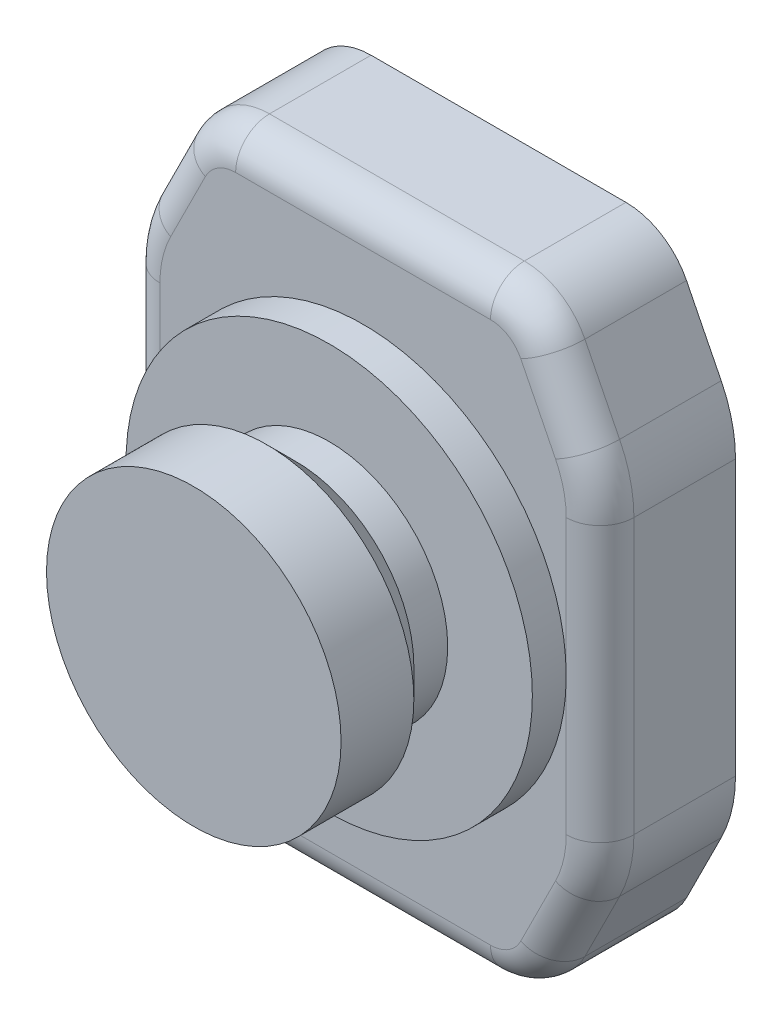
ISO-10303-21;
HEADER;
FILE_DESCRIPTION(('STEP AP214'),'2;1');
FILE_NAME('part.step','',(''),(''),'','','');
FILE_SCHEMA(('AUTOMOTIVE_DESIGN { 1 0 10303 214 1 1 1 1 }'));
ENDSEC;
DATA;
#1=APPLICATION_CONTEXT('core data for automotive mechanical design processes');
#2=APPLICATION_PROTOCOL_DEFINITION('international standard','automotive_design',2000,#1);
#3=PRODUCT_CONTEXT('',#1,'mechanical');
#4=PRODUCT('Part','Part','',(#3));
#5=PRODUCT_RELATED_PRODUCT_CATEGORY('part','',(#4));
#6=PRODUCT_DEFINITION_FORMATION('','',#4);
#7=PRODUCT_DEFINITION_CONTEXT('part definition',#1,'design');
#8=PRODUCT_DEFINITION('design','',#6,#7);
#9=PRODUCT_DEFINITION_SHAPE('','',#8);
#10=(LENGTH_UNIT() NAMED_UNIT(*) SI_UNIT(.MILLI.,.METRE.));
#11=(NAMED_UNIT(*) PLANE_ANGLE_UNIT() SI_UNIT($,.RADIAN.));
#12=(NAMED_UNIT(*) SI_UNIT($,.STERADIAN.) SOLID_ANGLE_UNIT());
#13=UNCERTAINTY_MEASURE_WITH_UNIT(LENGTH_MEASURE(1.E-05),#10,'distance_accuracy_value','');
#14=(GEOMETRIC_REPRESENTATION_CONTEXT(3) GLOBAL_UNCERTAINTY_ASSIGNED_CONTEXT((#13)) GLOBAL_UNIT_ASSIGNED_CONTEXT((#10,
#11,#12)) REPRESENTATION_CONTEXT('',''));
#15=CARTESIAN_POINT('',(0.,0.,0.));
#16=DIRECTION('',(0.,0.,1.));
#17=DIRECTION('',(1.,0.,0.));
#18=AXIS2_PLACEMENT_3D('',#15,#16,#17);
#19=CARTESIAN_POINT('',(-18.819660112501,-35.,20.));
#20=DIRECTION('',(0.,0.,1.));
#21=DIRECTION('',(1.,0.,0.));
#22=AXIS2_PLACEMENT_3D('',#19,#20,#21);
#23=PLANE('',#22);
#24=DIRECTION('',(0.,1.,0.));
#25=VECTOR('',#24,1.);
#26=CARTESIAN_POINT('',(30.,20.2786404500042,20.));
#27=LINE('',#26,#25);
#28=CARTESIAN_POINT('',(30.,-20.2786404500042,20.));
#29=VERTEX_POINT('',#28);
#30=CARTESIAN_POINT('',(30.,0.,20.));
#31=VERTEX_POINT('',#30);
#32=EDGE_CURVE('E215',#29,#31,#27,.T.);
#33=ORIENTED_EDGE('',*,*,#32,.T.);
#34=CARTESIAN_POINT('',(0.,0.,20.));
#35=DIRECTION('',(0.,0.,1.));
#36=DIRECTION('',(1.,0.,0.));
#37=AXIS2_PLACEMENT_3D('',#34,#35,#36);
#38=CIRCLE('',#37,30.);
#39=CARTESIAN_POINT('',(-30.,0.,20.));
#40=VERTEX_POINT('',#39);
#41=EDGE_CURVE('E51',#40,#31,#38,.T.);
#42=ORIENTED_EDGE('',*,*,#41,.F.);
#43=DIRECTION('',(0.,-1.,0.));
#44=VECTOR('',#43,1.);
#45=CARTESIAN_POINT('',(-30.,-20.2786404500042,20.));
#46=LINE('',#45,#44);
#47=CARTESIAN_POINT('',(-30.,-20.2786404500042,20.));
#48=VERTEX_POINT('',#47);
#49=EDGE_CURVE('E212',#40,#48,#46,.T.);
#50=ORIENTED_EDGE('',*,*,#49,.T.);
#51=CARTESIAN_POINT('',(-15.,-20.2786404500042,20.));
#52=DIRECTION('',(0.,0.,1.));
#53=DIRECTION('',(1.,0.,0.));
#54=AXIS2_PLACEMENT_3D('',#51,#52,#53);
#55=CIRCLE('',#54,15.);
#56=CARTESIAN_POINT('',(-28.4164078649987,-26.9868443825036,20.));
#57=VERTEX_POINT('',#56);
#58=EDGE_CURVE('E231',#48,#57,#55,.T.);
#59=ORIENTED_EDGE('',*,*,#58,.T.);
#60=DIRECTION('',(0.447213595499958,-0.894427190999916,0.));
#61=VECTOR('',#60,1.);
#62=CARTESIAN_POINT('',(-23.2917960675006,-37.2360679774998,20.));
#63=LINE('',#62,#61);
#64=CARTESIAN_POINT('',(-23.2917960675006,-37.2360679774998,20.));
#65=VERTEX_POINT('',#64);
#66=EDGE_CURVE('E232',#57,#65,#63,.T.);
#67=ORIENTED_EDGE('',*,*,#66,.T.);
#68=CARTESIAN_POINT('',(-18.819660112501,-35.,20.));
#69=DIRECTION('',(0.,0.,1.));
#70=DIRECTION('',(1.,0.,0.));
#71=AXIS2_PLACEMENT_3D('',#68,#69,#70);
#72=CIRCLE('',#71,5.);
#73=CARTESIAN_POINT('',(-18.819660112501,-40.,20.));
#74=VERTEX_POINT('',#73);
#75=EDGE_CURVE('E405',#65,#74,#72,.T.);
#76=ORIENTED_EDGE('',*,*,#75,.T.);
#77=DIRECTION('',(1.,0.,0.));
#78=VECTOR('',#77,1.);
#79=CARTESIAN_POINT('',(18.8196601125011,-40.,20.));
#80=LINE('',#79,#78);
#81=CARTESIAN_POINT('',(18.8196601125011,-40.,20.));
#82=VERTEX_POINT('',#81);
#83=EDGE_CURVE('E407',#74,#82,#80,.T.);
#84=ORIENTED_EDGE('',*,*,#83,.T.);
#85=CARTESIAN_POINT('',(18.819660112501,-35.,20.));
#86=DIRECTION('',(0.,0.,1.));
#87=DIRECTION('',(1.,0.,0.));
#88=AXIS2_PLACEMENT_3D('',#85,#86,#87);
#89=CIRCLE('',#88,5.);
#90=CARTESIAN_POINT('',(23.2917960675006,-37.2360679774998,20.));
#91=VERTEX_POINT('',#90);
#92=EDGE_CURVE('E409',#82,#91,#89,.T.);
#93=ORIENTED_EDGE('',*,*,#92,.T.);
#94=DIRECTION('',(0.447213595499958,0.894427190999916,0.));
#95=VECTOR('',#94,1.);
#96=CARTESIAN_POINT('',(28.4164078649987,-26.9868443825036,20.));
#97=LINE('',#96,#95);
#98=CARTESIAN_POINT('',(28.4164078649987,-26.9868443825036,20.));
#99=VERTEX_POINT('',#98);
#100=EDGE_CURVE('E411',#91,#99,#97,.T.);
#101=ORIENTED_EDGE('',*,*,#100,.T.);
#102=CARTESIAN_POINT('',(15.,-20.2786404500042,20.));
#103=DIRECTION('',(0.,0.,1.));
#104=DIRECTION('',(1.,0.,0.));
#105=AXIS2_PLACEMENT_3D('',#102,#103,#104);
#106=CIRCLE('',#105,15.);
#107=EDGE_CURVE('E413',#99,#29,#106,.T.);
#108=ORIENTED_EDGE('',*,*,#107,.T.);
#109=EDGE_LOOP('',(#33,#42,#50,#59,#67,#76,#84,#93,#101,#108));
#110=FACE_BOUND('',#109,.T.);
#111=ADVANCED_FACE('F36',(#110),#23,.T.);
#112=CARTESIAN_POINT('',(-18.819660112501,-35.,20.));
#113=DIRECTION('',(0.,0.,-1.));
#114=DIRECTION('',(-1.,0.,0.));
#115=AXIS2_PLACEMENT_3D('',#112,#113,#114);
#116=CYLINDRICAL_SURFACE('',#115,10.);
#117=DIRECTION('',(0.,0.,-1.));
#118=VECTOR('',#117,1.);
#119=CARTESIAN_POINT('',(-18.819660112501,-45.,20.));
#120=LINE('',#119,#118);
#121=CARTESIAN_POINT('',(-18.819660112501,-45.,15.));
#122=VERTEX_POINT('',#121);
#123=CARTESIAN_POINT('',(-18.819660112501,-45.,0.));
#124=VERTEX_POINT('',#123);
#125=EDGE_CURVE('E403',#122,#124,#120,.T.);
#126=ORIENTED_EDGE('',*,*,#125,.F.);
#127=CARTESIAN_POINT('',(-18.819660112501,-35.,15.));
#128=DIRECTION('',(0.,0.,1.));
#129=DIRECTION('',(1.,0.,0.));
#130=AXIS2_PLACEMENT_3D('',#127,#128,#129);
#131=CIRCLE('',#130,10.);
#132=CARTESIAN_POINT('',(-27.7639320225002,-39.4721359549996,15.));
#133=VERTEX_POINT('',#132);
#134=EDGE_CURVE('E269',#122,#133,#131,.F.);
#135=ORIENTED_EDGE('',*,*,#134,.T.);
#136=DIRECTION('',(0.,0.,-1.));
#137=VECTOR('',#136,1.);
#138=CARTESIAN_POINT('',(-27.7639320225002,-39.4721359549996,20.));
#139=LINE('',#138,#137);
#140=CARTESIAN_POINT('',(-27.7639320225002,-39.4721359549996,0.));
#141=VERTEX_POINT('',#140);
#142=EDGE_CURVE('E373',#133,#141,#139,.T.);
#143=ORIENTED_EDGE('',*,*,#142,.T.);
#144=CARTESIAN_POINT('',(-18.819660112501,-35.,0.));
#145=DIRECTION('',(0.,0.,1.));
#146=DIRECTION('',(1.,0.,0.));
#147=AXIS2_PLACEMENT_3D('',#144,#145,#146);
#148=CIRCLE('',#147,10.);
#149=EDGE_CURVE('E314',#141,#124,#148,.T.);
#150=ORIENTED_EDGE('',*,*,#149,.T.);
#151=EDGE_LOOP('',(#126,#135,#143,#150));
#152=FACE_BOUND('',#151,.T.);
#153=ADVANCED_FACE('F531',(#152),#116,.T.);
#154=CARTESIAN_POINT('',(-18.819660112501,-45.,20.));
#155=DIRECTION('',(0.,1.,0.));
#156=DIRECTION('',(0.,0.,1.));
#157=AXIS2_PLACEMENT_3D('',#154,#155,#156);
#158=PLANE('',#157);
#159=DIRECTION('',(0.,0.,-1.));
#160=VECTOR('',#159,1.);
#161=CARTESIAN_POINT('',(18.8196601125011,-45.,20.));
#162=LINE('',#161,#160);
#163=CARTESIAN_POINT('',(18.8196601125011,-45.,15.));
#164=VERTEX_POINT('',#163);
#165=CARTESIAN_POINT('',(18.8196601125011,-45.,0.));
#166=VERTEX_POINT('',#165);
#167=EDGE_CURVE('E401',#164,#166,#162,.T.);
#168=ORIENTED_EDGE('',*,*,#167,.F.);
#169=DIRECTION('',(1.,0.,0.));
#170=VECTOR('',#169,1.);
#171=CARTESIAN_POINT('',(-18.819660112501,-45.,15.));
#172=LINE('',#171,#170);
#173=EDGE_CURVE('E59',#164,#122,#172,.F.);
#174=ORIENTED_EDGE('',*,*,#173,.T.);
#175=ORIENTED_EDGE('',*,*,#125,.T.);
#176=DIRECTION('',(1.,0.,0.));
#177=VECTOR('',#176,1.);
#178=CARTESIAN_POINT('',(-18.819660112501,-45.,0.));
#179=LINE('',#178,#177);
#180=EDGE_CURVE('E328',#124,#166,#179,.T.);
#181=ORIENTED_EDGE('',*,*,#180,.T.);
#182=EDGE_LOOP('',(#168,#174,#175,#181));
#183=FACE_BOUND('',#182,.T.);
#184=ADVANCED_FACE('F533',(#183),#158,.F.);
#185=CARTESIAN_POINT('',(18.819660112501,-35.,20.));
#186=DIRECTION('',(0.,0.,-1.));
#187=DIRECTION('',(-1.,0.,0.));
#188=AXIS2_PLACEMENT_3D('',#185,#186,#187);
#189=CYLINDRICAL_SURFACE('',#188,10.);
#190=DIRECTION('',(0.,0.,-1.));
#191=VECTOR('',#190,1.);
#192=CARTESIAN_POINT('',(27.7639320225002,-39.4721359549996,20.));
#193=LINE('',#192,#191);
#194=CARTESIAN_POINT('',(27.7639320225002,-39.4721359549996,15.));
#195=VERTEX_POINT('',#194);
#196=CARTESIAN_POINT('',(27.7639320225002,-39.4721359549996,0.));
#197=VERTEX_POINT('',#196);
#198=EDGE_CURVE('E399',#195,#197,#193,.T.);
#199=ORIENTED_EDGE('',*,*,#198,.F.);
#200=CARTESIAN_POINT('',(18.819660112501,-35.,15.));
#201=DIRECTION('',(0.,0.,1.));
#202=DIRECTION('',(1.,0.,0.));
#203=AXIS2_PLACEMENT_3D('',#200,#201,#202);
#204=CIRCLE('',#203,10.);
#205=EDGE_CURVE('E266',#195,#164,#204,.F.);
#206=ORIENTED_EDGE('',*,*,#205,.T.);
#207=ORIENTED_EDGE('',*,*,#167,.T.);
#208=CARTESIAN_POINT('',(18.819660112501,-35.,0.));
#209=DIRECTION('',(0.,0.,1.));
#210=DIRECTION('',(-1.,0.,0.));
#211=AXIS2_PLACEMENT_3D('',#208,#209,#210);
#212=CIRCLE('',#211,10.);
#213=EDGE_CURVE('E331',#166,#197,#212,.T.);
#214=ORIENTED_EDGE('',*,*,#213,.T.);
#215=EDGE_LOOP('',(#199,#206,#207,#214));
#216=FACE_BOUND('',#215,.T.);
#217=ADVANCED_FACE('F539',(#216),#189,.T.);
#218=CARTESIAN_POINT('',(27.7639320225002,-39.4721359549996,20.));
#219=DIRECTION('',(-0.894427190999916,0.447213595499958,0.));
#220=DIRECTION('',(-0.447213595499958,-0.894427190999916,0.));
#221=AXIS2_PLACEMENT_3D('',#218,#219,#220);
#222=PLANE('',#221);
#223=DIRECTION('',(0.,0.,-1.));
#224=VECTOR('',#223,1.);
#225=CARTESIAN_POINT('',(32.8885438199983,-29.2229123600034,20.));
#226=LINE('',#225,#224);
#227=CARTESIAN_POINT('',(32.8885438199983,-29.2229123600034,15.));
#228=VERTEX_POINT('',#227);
#229=CARTESIAN_POINT('',(32.8885438199983,-29.2229123600034,0.));
#230=VERTEX_POINT('',#229);
#231=EDGE_CURVE('E397',#228,#230,#226,.T.);
#232=ORIENTED_EDGE('',*,*,#231,.F.);
#233=DIRECTION('',(0.447213595499958,0.894427190999916,0.));
#234=VECTOR('',#233,1.);
#235=CARTESIAN_POINT('',(27.7639320225002,-39.4721359549996,15.));
#236=LINE('',#235,#234);
#237=EDGE_CURVE('E264',#228,#195,#236,.F.);
#238=ORIENTED_EDGE('',*,*,#237,.T.);
#239=ORIENTED_EDGE('',*,*,#198,.T.);
#240=DIRECTION('',(0.447213595499958,0.894427190999916,0.));
#241=VECTOR('',#240,1.);
#242=CARTESIAN_POINT('',(27.7639320225002,-39.4721359549996,0.));
#243=LINE('',#242,#241);
#244=EDGE_CURVE('E334',#197,#230,#243,.T.);
#245=ORIENTED_EDGE('',*,*,#244,.T.);
#246=EDGE_LOOP('',(#232,#238,#239,#245));
#247=FACE_BOUND('',#246,.T.);
#248=ADVANCED_FACE('F542',(#247),#222,.F.);
#249=CARTESIAN_POINT('',(15.,-20.2786404500042,20.));
#250=DIRECTION('',(0.,0.,-1.));
#251=DIRECTION('',(-1.,0.,0.));
#252=AXIS2_PLACEMENT_3D('',#249,#250,#251);
#253=CYLINDRICAL_SURFACE('',#252,20.);
#254=DIRECTION('',(0.,0.,-1.));
#255=VECTOR('',#254,1.);
#256=CARTESIAN_POINT('',(35.,-20.2786404500042,20.));
#257=LINE('',#256,#255);
#258=CARTESIAN_POINT('',(35.,-20.2786404500042,15.));
#259=VERTEX_POINT('',#258);
#260=CARTESIAN_POINT('',(35.,-20.2786404500042,0.));
#261=VERTEX_POINT('',#260);
#262=EDGE_CURVE('E395',#259,#261,#257,.T.);
#263=ORIENTED_EDGE('',*,*,#262,.F.);
#264=CARTESIAN_POINT('',(15.,-20.2786404500042,15.));
#265=DIRECTION('',(0.,0.,1.));
#266=DIRECTION('',(1.,0.,0.));
#267=AXIS2_PLACEMENT_3D('',#264,#265,#266);
#268=CIRCLE('',#267,20.);
#269=EDGE_CURVE('E262',#259,#228,#268,.F.);
#270=ORIENTED_EDGE('',*,*,#269,.T.);
#271=ORIENTED_EDGE('',*,*,#231,.T.);
#272=CARTESIAN_POINT('',(15.,-20.2786404500042,0.));
#273=DIRECTION('',(0.,0.,1.));
#274=DIRECTION('',(1.,0.,0.));
#275=AXIS2_PLACEMENT_3D('',#272,#273,#274);
#276=CIRCLE('',#275,20.);
#277=EDGE_CURVE('E337',#230,#261,#276,.T.);
#278=ORIENTED_EDGE('',*,*,#277,.T.);
#279=EDGE_LOOP('',(#263,#270,#271,#278));
#280=FACE_BOUND('',#279,.T.);
#281=ADVANCED_FACE('F545',(#280),#253,.T.);
#282=CARTESIAN_POINT('',(35.,-20.2786404500042,20.));
#283=DIRECTION('',(-1.,0.,0.));
#284=DIRECTION('',(0.,0.,1.));
#285=AXIS2_PLACEMENT_3D('',#282,#283,#284);
#286=PLANE('',#285);
#287=DIRECTION('',(0.,0.,-1.));
#288=VECTOR('',#287,1.);
#289=CARTESIAN_POINT('',(35.,20.2786404500042,20.));
#290=LINE('',#289,#288);
#291=CARTESIAN_POINT('',(35.,20.2786404500042,15.));
#292=VERTEX_POINT('',#291);
#293=CARTESIAN_POINT('',(35.,20.2786404500042,0.));
#294=VERTEX_POINT('',#293);
#295=EDGE_CURVE('E393',#292,#294,#290,.T.);
#296=ORIENTED_EDGE('',*,*,#295,.F.);
#297=DIRECTION('',(0.,1.,0.));
#298=VECTOR('',#297,1.);
#299=CARTESIAN_POINT('',(35.,-20.2786404500042,15.));
#300=LINE('',#299,#298);
#301=EDGE_CURVE('E260',#292,#259,#300,.F.);
#302=ORIENTED_EDGE('',*,*,#301,.T.);
#303=ORIENTED_EDGE('',*,*,#262,.T.);
#304=DIRECTION('',(0.,1.,0.));
#305=VECTOR('',#304,1.);
#306=CARTESIAN_POINT('',(35.,-20.2786404500042,0.));
#307=LINE('',#306,#305);
#308=EDGE_CURVE('E340',#261,#294,#307,.T.);
#309=ORIENTED_EDGE('',*,*,#308,.T.);
#310=EDGE_LOOP('',(#296,#302,#303,#309));
#311=FACE_BOUND('',#310,.T.);
#312=ADVANCED_FACE('F549',(#311),#286,.F.);
#313=CARTESIAN_POINT('',(15.,20.2786404500042,20.));
#314=DIRECTION('',(0.,0.,-1.));
#315=DIRECTION('',(-1.,0.,0.));
#316=AXIS2_PLACEMENT_3D('',#313,#314,#315);
#317=CYLINDRICAL_SURFACE('',#316,20.);
#318=DIRECTION('',(0.,0.,-1.));
#319=VECTOR('',#318,1.);
#320=CARTESIAN_POINT('',(32.8885438199983,29.2229123600033,20.));
#321=LINE('',#320,#319);
#322=CARTESIAN_POINT('',(32.8885438199983,29.2229123600033,15.));
#323=VERTEX_POINT('',#322);
#324=CARTESIAN_POINT('',(32.8885438199983,29.2229123600033,0.));
#325=VERTEX_POINT('',#324);
#326=EDGE_CURVE('E391',#323,#325,#321,.T.);
#327=ORIENTED_EDGE('',*,*,#326,.F.);
#328=CARTESIAN_POINT('',(15.,20.2786404500042,15.));
#329=DIRECTION('',(0.,0.,1.));
#330=DIRECTION('',(1.,0.,0.));
#331=AXIS2_PLACEMENT_3D('',#328,#329,#330);
#332=CIRCLE('',#331,20.);
#333=EDGE_CURVE('E258',#323,#292,#332,.F.);
#334=ORIENTED_EDGE('',*,*,#333,.T.);
#335=ORIENTED_EDGE('',*,*,#295,.T.);
#336=CARTESIAN_POINT('',(15.,20.2786404500042,0.));
#337=DIRECTION('',(0.,0.,1.));
#338=DIRECTION('',(-1.,0.,0.));
#339=AXIS2_PLACEMENT_3D('',#336,#337,#338);
#340=CIRCLE('',#339,20.);
#341=EDGE_CURVE('E343',#294,#325,#340,.T.);
#342=ORIENTED_EDGE('',*,*,#341,.T.);
#343=EDGE_LOOP('',(#327,#334,#335,#342));
#344=FACE_BOUND('',#343,.T.);
#345=ADVANCED_FACE('F553',(#344),#317,.T.);
#346=CARTESIAN_POINT('',(27.7639320225002,39.4721359549996,20.));
#347=DIRECTION('',(-0.894427190999916,-0.447213595499958,0.));
#348=DIRECTION('',(0.447213595499958,-0.894427190999916,0.));
#349=AXIS2_PLACEMENT_3D('',#346,#347,#348);
#350=PLANE('',#349);
#351=DIRECTION('',(0.,0.,-1.));
#352=VECTOR('',#351,1.);
#353=CARTESIAN_POINT('',(27.7639320225002,39.4721359549996,20.));
#354=LINE('',#353,#352);
#355=CARTESIAN_POINT('',(27.7639320225002,39.4721359549996,15.));
#356=VERTEX_POINT('',#355);
#357=CARTESIAN_POINT('',(27.7639320225002,39.4721359549996,0.));
#358=VERTEX_POINT('',#357);
#359=EDGE_CURVE('E389',#356,#358,#354,.T.);
#360=ORIENTED_EDGE('',*,*,#359,.F.);
#361=DIRECTION('',(-0.447213595499958,0.894427190999916,0.));
#362=VECTOR('',#361,1.);
#363=CARTESIAN_POINT('',(32.8885438199983,29.2229123600034,15.));
#364=LINE('',#363,#362);
#365=EDGE_CURVE('E256',#356,#323,#364,.F.);
#366=ORIENTED_EDGE('',*,*,#365,.T.);
#367=ORIENTED_EDGE('',*,*,#326,.T.);
#368=DIRECTION('',(-0.447213595499958,0.894427190999916,0.));
#369=VECTOR('',#368,1.);
#370=CARTESIAN_POINT('',(27.7639320225002,39.4721359549996,0.));
#371=LINE('',#370,#369);
#372=EDGE_CURVE('E346',#325,#358,#371,.T.);
#373=ORIENTED_EDGE('',*,*,#372,.T.);
#374=EDGE_LOOP('',(#360,#366,#367,#373));
#375=FACE_BOUND('',#374,.T.);
#376=ADVANCED_FACE('F557',(#375),#350,.F.);
#377=CARTESIAN_POINT('',(18.819660112501,35.,20.));
#378=DIRECTION('',(0.,0.,-1.));
#379=DIRECTION('',(-1.,0.,0.));
#380=AXIS2_PLACEMENT_3D('',#377,#378,#379);
#381=CYLINDRICAL_SURFACE('',#380,10.);
#382=DIRECTION('',(0.,0.,-1.));
#383=VECTOR('',#382,1.);
#384=CARTESIAN_POINT('',(18.819660112501,45.,20.));
#385=LINE('',#384,#383);
#386=CARTESIAN_POINT('',(18.819660112501,45.,15.));
#387=VERTEX_POINT('',#386);
#388=CARTESIAN_POINT('',(18.819660112501,45.,0.));
#389=VERTEX_POINT('',#388);
#390=EDGE_CURVE('E387',#387,#389,#385,.T.);
#391=ORIENTED_EDGE('',*,*,#390,.F.);
#392=CARTESIAN_POINT('',(18.819660112501,35.,15.));
#393=DIRECTION('',(0.,0.,1.));
#394=DIRECTION('',(1.,0.,0.));
#395=AXIS2_PLACEMENT_3D('',#392,#393,#394);
#396=CIRCLE('',#395,10.);
#397=EDGE_CURVE('E254',#387,#356,#396,.F.);
#398=ORIENTED_EDGE('',*,*,#397,.T.);
#399=ORIENTED_EDGE('',*,*,#359,.T.);
#400=CARTESIAN_POINT('',(18.819660112501,35.,0.));
#401=DIRECTION('',(0.,0.,1.));
#402=DIRECTION('',(1.,0.,0.));
#403=AXIS2_PLACEMENT_3D('',#400,#401,#402);
#404=CIRCLE('',#403,10.);
#405=EDGE_CURVE('E349',#358,#389,#404,.T.);
#406=ORIENTED_EDGE('',*,*,#405,.T.);
#407=EDGE_LOOP('',(#391,#398,#399,#406));
#408=FACE_BOUND('',#407,.T.);
#409=ADVANCED_FACE('F559',(#408),#381,.T.);
#410=CARTESIAN_POINT('',(-18.8196601125011,45.,20.));
#411=DIRECTION('',(0.,-1.,0.));
#412=DIRECTION('',(0.,0.,-1.));
#413=AXIS2_PLACEMENT_3D('',#410,#411,#412);
#414=PLANE('',#413);
#415=DIRECTION('',(0.,0.,-1.));
#416=VECTOR('',#415,1.);
#417=CARTESIAN_POINT('',(-18.8196601125011,45.,20.));
#418=LINE('',#417,#416);
#419=CARTESIAN_POINT('',(-18.8196601125011,45.,15.));
#420=VERTEX_POINT('',#419);
#421=CARTESIAN_POINT('',(-18.8196601125011,45.,0.));
#422=VERTEX_POINT('',#421);
#423=EDGE_CURVE('E385',#420,#422,#418,.T.);
#424=ORIENTED_EDGE('',*,*,#423,.F.);
#425=DIRECTION('',(-1.,0.,0.));
#426=VECTOR('',#425,1.);
#427=CARTESIAN_POINT('',(18.819660112501,45.,15.));
#428=LINE('',#427,#426);
#429=EDGE_CURVE('E252',#420,#387,#428,.F.);
#430=ORIENTED_EDGE('',*,*,#429,.T.);
#431=ORIENTED_EDGE('',*,*,#390,.T.);
#432=DIRECTION('',(-1.,0.,0.));
#433=VECTOR('',#432,1.);
#434=CARTESIAN_POINT('',(-18.8196601125011,45.,0.));
#435=LINE('',#434,#433);
#436=EDGE_CURVE('E352',#389,#422,#435,.T.);
#437=ORIENTED_EDGE('',*,*,#436,.T.);
#438=EDGE_LOOP('',(#424,#430,#431,#437));
#439=FACE_BOUND('',#438,.T.);
#440=ADVANCED_FACE('F505',(#439),#414,.F.);
#441=CARTESIAN_POINT('',(-18.8196601125011,35.,20.));
#442=DIRECTION('',(0.,0.,-1.));
#443=DIRECTION('',(-1.,0.,0.));
#444=AXIS2_PLACEMENT_3D('',#441,#442,#443);
#445=CYLINDRICAL_SURFACE('',#444,10.);
#446=DIRECTION('',(0.,0.,-1.));
#447=VECTOR('',#446,1.);
#448=CARTESIAN_POINT('',(-27.7639320225002,39.4721359549996,20.));
#449=LINE('',#448,#447);
#450=CARTESIAN_POINT('',(-27.7639320225002,39.4721359549996,15.));
#451=VERTEX_POINT('',#450);
#452=CARTESIAN_POINT('',(-27.7639320225002,39.4721359549996,0.));
#453=VERTEX_POINT('',#452);
#454=EDGE_CURVE('E383',#451,#453,#449,.T.);
#455=ORIENTED_EDGE('',*,*,#454,.F.);
#456=CARTESIAN_POINT('',(-18.8196601125011,35.,15.));
#457=DIRECTION('',(0.,0.,1.));
#458=DIRECTION('',(1.,0.,0.));
#459=AXIS2_PLACEMENT_3D('',#456,#457,#458);
#460=CIRCLE('',#459,10.);
#461=EDGE_CURVE('E250',#451,#420,#460,.F.);
#462=ORIENTED_EDGE('',*,*,#461,.T.);
#463=ORIENTED_EDGE('',*,*,#423,.T.);
#464=CARTESIAN_POINT('',(-18.8196601125011,35.,0.));
#465=DIRECTION('',(0.,0.,1.));
#466=DIRECTION('',(-1.,0.,0.));
#467=AXIS2_PLACEMENT_3D('',#464,#465,#466);
#468=CIRCLE('',#467,10.);
#469=EDGE_CURVE('E355',#422,#453,#468,.T.);
#470=ORIENTED_EDGE('',*,*,#469,.T.);
#471=EDGE_LOOP('',(#455,#462,#463,#470));
#472=FACE_BOUND('',#471,.T.);
#473=ADVANCED_FACE('F503',(#472),#445,.T.);
#474=CARTESIAN_POINT('',(-32.8885438199983,29.2229123600033,20.));
#475=DIRECTION('',(0.894427190999916,-0.447213595499958,0.));
#476=DIRECTION('',(0.447213595499958,0.894427190999916,0.));
#477=AXIS2_PLACEMENT_3D('',#474,#475,#476);
#478=PLANE('',#477);
#479=DIRECTION('',(0.,0.,-1.));
#480=VECTOR('',#479,1.);
#481=CARTESIAN_POINT('',(-32.8885438199983,29.2229123600033,20.));
#482=LINE('',#481,#480);
#483=CARTESIAN_POINT('',(-32.8885438199983,29.2229123600033,15.));
#484=VERTEX_POINT('',#483);
#485=CARTESIAN_POINT('',(-32.8885438199983,29.2229123600033,0.));
#486=VERTEX_POINT('',#485);
#487=EDGE_CURVE('E381',#484,#486,#482,.T.);
#488=ORIENTED_EDGE('',*,*,#487,.F.);
#489=DIRECTION('',(-0.447213595499958,-0.894427190999916,0.));
#490=VECTOR('',#489,1.);
#491=CARTESIAN_POINT('',(-27.7639320225002,39.4721359549996,15.));
#492=LINE('',#491,#490);
#493=EDGE_CURVE('E248',#484,#451,#492,.F.);
#494=ORIENTED_EDGE('',*,*,#493,.T.);
#495=ORIENTED_EDGE('',*,*,#454,.T.);
#496=DIRECTION('',(-0.447213595499958,-0.894427190999916,0.));
#497=VECTOR('',#496,1.);
#498=CARTESIAN_POINT('',(-32.8885438199983,29.2229123600033,0.));
#499=LINE('',#498,#497);
#500=EDGE_CURVE('E358',#453,#486,#499,.T.);
#501=ORIENTED_EDGE('',*,*,#500,.T.);
#502=EDGE_LOOP('',(#488,#494,#495,#501));
#503=FACE_BOUND('',#502,.T.);
#504=ADVANCED_FACE('F518',(#503),#478,.F.);
#505=CARTESIAN_POINT('',(-15.,20.2786404500042,20.));
#506=DIRECTION('',(0.,0.,-1.));
#507=DIRECTION('',(-1.,0.,0.));
#508=AXIS2_PLACEMENT_3D('',#505,#506,#507);
#509=CYLINDRICAL_SURFACE('',#508,20.);
#510=DIRECTION('',(0.,0.,-1.));
#511=VECTOR('',#510,1.);
#512=CARTESIAN_POINT('',(-35.,20.2786404500042,20.));
#513=LINE('',#512,#511);
#514=CARTESIAN_POINT('',(-35.,20.2786404500042,15.));
#515=VERTEX_POINT('',#514);
#516=CARTESIAN_POINT('',(-35.,20.2786404500042,0.));
#517=VERTEX_POINT('',#516);
#518=EDGE_CURVE('E379',#515,#517,#513,.T.);
#519=ORIENTED_EDGE('',*,*,#518,.F.);
#520=CARTESIAN_POINT('',(-15.,20.2786404500042,15.));
#521=DIRECTION('',(0.,0.,1.));
#522=DIRECTION('',(1.,0.,0.));
#523=AXIS2_PLACEMENT_3D('',#520,#521,#522);
#524=CIRCLE('',#523,20.);
#525=EDGE_CURVE('E246',#515,#484,#524,.F.);
#526=ORIENTED_EDGE('',*,*,#525,.T.);
#527=ORIENTED_EDGE('',*,*,#487,.T.);
#528=CARTESIAN_POINT('',(-15.,20.2786404500042,0.));
#529=DIRECTION('',(0.,0.,1.));
#530=DIRECTION('',(1.,0.,0.));
#531=AXIS2_PLACEMENT_3D('',#528,#529,#530);
#532=CIRCLE('',#531,20.);
#533=EDGE_CURVE('E361',#486,#517,#532,.T.);
#534=ORIENTED_EDGE('',*,*,#533,.T.);
#535=EDGE_LOOP('',(#519,#526,#527,#534));
#536=FACE_BOUND('',#535,.T.);
#537=ADVANCED_FACE('F520',(#536),#509,.T.);
#538=CARTESIAN_POINT('',(-35.,-20.2786404500042,20.));
#539=DIRECTION('',(1.,0.,0.));
#540=DIRECTION('',(0.,0.,-1.));
#541=AXIS2_PLACEMENT_3D('',#538,#539,#540);
#542=PLANE('',#541);
#543=DIRECTION('',(0.,0.,-1.));
#544=VECTOR('',#543,1.);
#545=CARTESIAN_POINT('',(-35.,-20.2786404500042,20.));
#546=LINE('',#545,#544);
#547=CARTESIAN_POINT('',(-35.,-20.2786404500042,15.));
#548=VERTEX_POINT('',#547);
#549=CARTESIAN_POINT('',(-35.,-20.2786404500042,0.));
#550=VERTEX_POINT('',#549);
#551=EDGE_CURVE('E377',#548,#550,#546,.T.);
#552=ORIENTED_EDGE('',*,*,#551,.F.);
#553=DIRECTION('',(0.,-1.,0.));
#554=VECTOR('',#553,1.);
#555=CARTESIAN_POINT('',(-35.,20.2786404500042,15.));
#556=LINE('',#555,#554);
#557=EDGE_CURVE('E244',#548,#515,#556,.F.);
#558=ORIENTED_EDGE('',*,*,#557,.T.);
#559=ORIENTED_EDGE('',*,*,#518,.T.);
#560=DIRECTION('',(0.,-1.,0.));
#561=VECTOR('',#560,1.);
#562=CARTESIAN_POINT('',(-35.,-20.2786404500042,0.));
#563=LINE('',#562,#561);
#564=EDGE_CURVE('E364',#517,#550,#563,.T.);
#565=ORIENTED_EDGE('',*,*,#564,.T.);
#566=EDGE_LOOP('',(#552,#558,#559,#565));
#567=FACE_BOUND('',#566,.T.);
#568=ADVANCED_FACE('F521',(#567),#542,.F.);
#569=CARTESIAN_POINT('',(-15.,-20.2786404500042,20.));
#570=DIRECTION('',(0.,0.,-1.));
#571=DIRECTION('',(-1.,0.,0.));
#572=AXIS2_PLACEMENT_3D('',#569,#570,#571);
#573=CYLINDRICAL_SURFACE('',#572,20.);
#574=DIRECTION('',(0.,0.,-1.));
#575=VECTOR('',#574,1.);
#576=CARTESIAN_POINT('',(-32.8885438199983,-29.2229123600034,20.));
#577=LINE('',#576,#575);
#578=CARTESIAN_POINT('',(-32.8885438199983,-29.2229123600034,15.));
#579=VERTEX_POINT('',#578);
#580=CARTESIAN_POINT('',(-32.8885438199983,-29.2229123600034,0.));
#581=VERTEX_POINT('',#580);
#582=EDGE_CURVE('E375',#579,#581,#577,.T.);
#583=ORIENTED_EDGE('',*,*,#582,.F.);
#584=CARTESIAN_POINT('',(-15.,-20.2786404500042,15.));
#585=DIRECTION('',(0.,0.,1.));
#586=DIRECTION('',(1.,0.,0.));
#587=AXIS2_PLACEMENT_3D('',#584,#585,#586);
#588=CIRCLE('',#587,20.);
#589=EDGE_CURVE('E242',#579,#548,#588,.F.);
#590=ORIENTED_EDGE('',*,*,#589,.T.);
#591=ORIENTED_EDGE('',*,*,#551,.T.);
#592=CARTESIAN_POINT('',(-15.,-20.2786404500042,0.));
#593=DIRECTION('',(0.,0.,1.));
#594=DIRECTION('',(-1.,0.,0.));
#595=AXIS2_PLACEMENT_3D('',#592,#593,#594);
#596=CIRCLE('',#595,20.);
#597=EDGE_CURVE('E367',#550,#581,#596,.T.);
#598=ORIENTED_EDGE('',*,*,#597,.T.);
#599=EDGE_LOOP('',(#583,#590,#591,#598));
#600=FACE_BOUND('',#599,.T.);
#601=ADVANCED_FACE('F526',(#600),#573,.T.);
#602=CARTESIAN_POINT('',(-32.8885438199983,-29.2229123600034,20.));
#603=DIRECTION('',(0.894427190999916,0.447213595499958,0.));
#604=DIRECTION('',(-0.447213595499958,0.894427190999916,0.));
#605=AXIS2_PLACEMENT_3D('',#602,#603,#604);
#606=PLANE('',#605);
#607=ORIENTED_EDGE('',*,*,#142,.F.);
#608=DIRECTION('',(0.447213595499958,-0.894427190999916,0.));
#609=VECTOR('',#608,1.);
#610=CARTESIAN_POINT('',(-32.8885438199983,-29.2229123600034,15.));
#611=LINE('',#610,#609);
#612=EDGE_CURVE('E239',#133,#579,#611,.F.);
#613=ORIENTED_EDGE('',*,*,#612,.T.);
#614=ORIENTED_EDGE('',*,*,#582,.T.);
#615=DIRECTION('',(0.447213595499958,-0.894427190999916,0.));
#616=VECTOR('',#615,1.);
#617=CARTESIAN_POINT('',(-32.8885438199983,-29.2229123600034,0.));
#618=LINE('',#617,#616);
#619=EDGE_CURVE('E370',#581,#141,#618,.T.);
#620=ORIENTED_EDGE('',*,*,#619,.T.);
#621=EDGE_LOOP('',(#607,#613,#614,#620));
#622=FACE_BOUND('',#621,.T.);
#623=ADVANCED_FACE('F529',(#622),#606,.F.);
#624=CARTESIAN_POINT('',(-30.,20.2786404500042,20.));
#625=VERTEX_POINT('',#624);
#626=EDGE_CURVE('E221',#625,#40,#46,.T.);
#627=ORIENTED_EDGE('',*,*,#626,.T.);
#628=EDGE_CURVE('E202',#31,#40,#38,.T.);
#629=ORIENTED_EDGE('',*,*,#628,.F.);
#630=CARTESIAN_POINT('',(30.,20.2786404500042,20.));
#631=VERTEX_POINT('',#630);
#632=EDGE_CURVE('E415',#31,#631,#27,.T.);
#633=ORIENTED_EDGE('',*,*,#632,.T.);
#634=CARTESIAN_POINT('',(15.,20.2786404500042,20.));
#635=DIRECTION('',(0.,0.,1.));
#636=DIRECTION('',(1.,0.,0.));
#637=AXIS2_PLACEMENT_3D('',#634,#635,#636);
#638=CIRCLE('',#637,15.);
#639=CARTESIAN_POINT('',(28.4164078649987,26.9868443825036,20.));
#640=VERTEX_POINT('',#639);
#641=EDGE_CURVE('E417',#631,#640,#638,.T.);
#642=ORIENTED_EDGE('',*,*,#641,.T.);
#643=DIRECTION('',(-0.447213595499958,0.894427190999916,0.));
#644=VECTOR('',#643,1.);
#645=CARTESIAN_POINT('',(23.2917960675006,37.2360679774998,20.));
#646=LINE('',#645,#644);
#647=CARTESIAN_POINT('',(23.2917960675006,37.2360679774998,20.));
#648=VERTEX_POINT('',#647);
#649=EDGE_CURVE('E419',#640,#648,#646,.T.);
#650=ORIENTED_EDGE('',*,*,#649,.T.);
#651=CARTESIAN_POINT('',(18.819660112501,35.,20.));
#652=DIRECTION('',(0.,0.,1.));
#653=DIRECTION('',(1.,0.,0.));
#654=AXIS2_PLACEMENT_3D('',#651,#652,#653);
#655=CIRCLE('',#654,5.);
#656=CARTESIAN_POINT('',(18.819660112501,40.,20.));
#657=VERTEX_POINT('',#656);
#658=EDGE_CURVE('E421',#648,#657,#655,.T.);
#659=ORIENTED_EDGE('',*,*,#658,.T.);
#660=DIRECTION('',(-1.,0.,0.));
#661=VECTOR('',#660,1.);
#662=CARTESIAN_POINT('',(-18.8196601125011,40.,20.));
#663=LINE('',#662,#661);
#664=CARTESIAN_POINT('',(-18.8196601125011,40.,20.));
#665=VERTEX_POINT('',#664);
#666=EDGE_CURVE('E423',#657,#665,#663,.T.);
#667=ORIENTED_EDGE('',*,*,#666,.T.);
#668=CARTESIAN_POINT('',(-18.8196601125011,35.,20.));
#669=DIRECTION('',(0.,0.,1.));
#670=DIRECTION('',(1.,0.,0.));
#671=AXIS2_PLACEMENT_3D('',#668,#669,#670);
#672=CIRCLE('',#671,5.);
#673=CARTESIAN_POINT('',(-23.2917960675006,37.2360679774998,20.));
#674=VERTEX_POINT('',#673);
#675=EDGE_CURVE('E425',#665,#674,#672,.T.);
#676=ORIENTED_EDGE('',*,*,#675,.T.);
#677=DIRECTION('',(-0.447213595499958,-0.894427190999916,0.));
#678=VECTOR('',#677,1.);
#679=CARTESIAN_POINT('',(-28.4164078649987,26.9868443825036,20.));
#680=LINE('',#679,#678);
#681=CARTESIAN_POINT('',(-28.4164078649987,26.9868443825036,20.));
#682=VERTEX_POINT('',#681);
#683=EDGE_CURVE('E426',#674,#682,#680,.T.);
#684=ORIENTED_EDGE('',*,*,#683,.T.);
#685=CARTESIAN_POINT('',(-15.,20.2786404500042,20.));
#686=DIRECTION('',(0.,0.,1.));
#687=DIRECTION('',(1.,0.,0.));
#688=AXIS2_PLACEMENT_3D('',#685,#686,#687);
#689=CIRCLE('',#688,15.);
#690=EDGE_CURVE('E226',#682,#625,#689,.T.);
#691=ORIENTED_EDGE('',*,*,#690,.T.);
#692=EDGE_LOOP('',(#627,#629,#633,#642,#650,#659,#667,#676,#684,#691));
#693=FACE_BOUND('',#692,.T.);
#694=ADVANCED_FACE('F228',(#693),#23,.T.);
#695=CARTESIAN_POINT('',(-18.819660112501,-35.,0.));
#696=DIRECTION('',(0.,0.,1.));
#697=DIRECTION('',(1.,0.,0.));
#698=AXIS2_PLACEMENT_3D('',#695,#696,#697);
#699=PLANE('',#698);
#700=ORIENTED_EDGE('',*,*,#149,.F.);
#701=ORIENTED_EDGE('',*,*,#619,.F.);
#702=ORIENTED_EDGE('',*,*,#597,.F.);
#703=ORIENTED_EDGE('',*,*,#564,.F.);
#704=ORIENTED_EDGE('',*,*,#533,.F.);
#705=ORIENTED_EDGE('',*,*,#500,.F.);
#706=ORIENTED_EDGE('',*,*,#469,.F.);
#707=ORIENTED_EDGE('',*,*,#436,.F.);
#708=ORIENTED_EDGE('',*,*,#405,.F.);
#709=ORIENTED_EDGE('',*,*,#372,.F.);
#710=ORIENTED_EDGE('',*,*,#341,.F.);
#711=ORIENTED_EDGE('',*,*,#308,.F.);
#712=ORIENTED_EDGE('',*,*,#277,.F.);
#713=ORIENTED_EDGE('',*,*,#244,.F.);
#714=ORIENTED_EDGE('',*,*,#213,.F.);
#715=ORIENTED_EDGE('',*,*,#180,.F.);
#716=EDGE_LOOP('',(#700,#701,#702,#703,#704,#705,#706,#707,#708,#709,#710,#711,#712,#713,#714,#715));
#717=FACE_BOUND('',#716,.T.);
#718=ADVANCED_FACE('F513',(#717),#699,.F.);
#719=CARTESIAN_POINT('',(43.7639320225002,-3.70820393249936,15.));
#720=DIRECTION('',(0.447213595499958,-0.894427190999916,0.));
#721=DIRECTION('',(0.894427190999916,0.447213595499958,0.));
#722=AXIS2_PLACEMENT_3D('',#719,#720,#721);
#723=CYLINDRICAL_SURFACE('',#722,5.);
#724=CARTESIAN_POINT('',(28.4164078649987,26.9868443825036,15.));
#725=DIRECTION('',(0.447213595499958,-0.894427190999916,0.));
#726=DIRECTION('',(0.894427190999916,0.447213595499958,0.));
#727=AXIS2_PLACEMENT_3D('',#724,#725,#726);
#728=CIRCLE('',#727,5.);
#729=EDGE_CURVE('E309',#323,#640,#728,.T.);
#730=ORIENTED_EDGE('',*,*,#729,.F.);
#731=ORIENTED_EDGE('',*,*,#365,.F.);
#732=CARTESIAN_POINT('',(23.2917960675006,37.2360679774998,15.));
#733=DIRECTION('',(-0.447213595499958,0.894427190999916,0.));
#734=DIRECTION('',(-0.894427190999916,-0.447213595499958,0.));
#735=AXIS2_PLACEMENT_3D('',#732,#733,#734);
#736=CIRCLE('',#735,5.);
#737=EDGE_CURVE('E312',#648,#356,#736,.T.);
#738=ORIENTED_EDGE('',*,*,#737,.F.);
#739=ORIENTED_EDGE('',*,*,#649,.F.);
#740=EDGE_LOOP('',(#730,#731,#738,#739));
#741=FACE_BOUND('',#740,.T.);
#742=ADVANCED_FACE('F485',(#741),#723,.T.);
#743=CARTESIAN_POINT('',(18.819660112501,35.,15.));
#744=DIRECTION('',(0.,0.,1.));
#745=DIRECTION('',(1.,0.,0.));
#746=AXIS2_PLACEMENT_3D('',#743,#744,#745);
#747=TOROIDAL_SURFACE('',#746,5.,5.);
#748=ORIENTED_EDGE('',*,*,#737,.T.);
#749=ORIENTED_EDGE('',*,*,#397,.F.);
#750=CARTESIAN_POINT('',(18.819660112501,40.,15.));
#751=DIRECTION('',(-1.,0.,0.));
#752=DIRECTION('',(0.,0.,1.));
#753=AXIS2_PLACEMENT_3D('',#750,#751,#752);
#754=CIRCLE('',#753,5.);
#755=EDGE_CURVE('E306',#657,#387,#754,.T.);
#756=ORIENTED_EDGE('',*,*,#755,.F.);
#757=ORIENTED_EDGE('',*,*,#658,.F.);
#758=EDGE_LOOP('',(#748,#749,#756,#757));
#759=FACE_BOUND('',#758,.T.);
#760=ADVANCED_FACE('F493',(#759),#747,.T.);
#761=CARTESIAN_POINT('',(15.,20.2786404500042,15.));
#762=DIRECTION('',(0.,0.,1.));
#763=DIRECTION('',(1.,0.,0.));
#764=AXIS2_PLACEMENT_3D('',#761,#762,#763);
#765=TOROIDAL_SURFACE('',#764,15.,5.);
#766=ORIENTED_EDGE('',*,*,#729,.T.);
#767=ORIENTED_EDGE('',*,*,#641,.F.);
#768=CARTESIAN_POINT('',(30.,20.2786404500042,15.));
#769=DIRECTION('',(0.,-1.,0.));
#770=DIRECTION('',(0.,0.,-1.));
#771=AXIS2_PLACEMENT_3D('',#768,#769,#770);
#772=CIRCLE('',#771,5.);
#773=EDGE_CURVE('E303',#292,#631,#772,.T.);
#774=ORIENTED_EDGE('',*,*,#773,.F.);
#775=ORIENTED_EDGE('',*,*,#333,.F.);
#776=EDGE_LOOP('',(#766,#767,#774,#775));
#777=FACE_BOUND('',#776,.T.);
#778=ADVANCED_FACE('F480',(#777),#765,.T.);
#779=CARTESIAN_POINT('',(-18.819660112501,40.,15.));
#780=DIRECTION('',(1.,0.,0.));
#781=DIRECTION('',(0.,0.,-1.));
#782=AXIS2_PLACEMENT_3D('',#779,#780,#781);
#783=CYLINDRICAL_SURFACE('',#782,5.);
#784=ORIENTED_EDGE('',*,*,#755,.T.);
#785=ORIENTED_EDGE('',*,*,#429,.F.);
#786=CARTESIAN_POINT('',(-18.8196601125011,40.,15.));
#787=DIRECTION('',(-1.,0.,0.));
#788=DIRECTION('',(0.,0.,1.));
#789=AXIS2_PLACEMENT_3D('',#786,#787,#788);
#790=CIRCLE('',#789,5.);
#791=EDGE_CURVE('E300',#665,#420,#790,.T.);
#792=ORIENTED_EDGE('',*,*,#791,.F.);
#793=ORIENTED_EDGE('',*,*,#666,.F.);
#794=EDGE_LOOP('',(#784,#785,#792,#793));
#795=FACE_BOUND('',#794,.T.);
#796=ADVANCED_FACE('F496',(#795),#783,.T.);
#797=CARTESIAN_POINT('',(30.,-35.,15.));
#798=DIRECTION('',(0.,-1.,0.));
#799=DIRECTION('',(0.,0.,-1.));
#800=AXIS2_PLACEMENT_3D('',#797,#798,#799);
#801=CYLINDRICAL_SURFACE('',#800,5.);
#802=ORIENTED_EDGE('',*,*,#773,.T.);
#803=ORIENTED_EDGE('',*,*,#632,.F.);
#804=ORIENTED_EDGE('',*,*,#32,.F.);
#805=CARTESIAN_POINT('',(30.,-20.2786404500042,15.));
#806=DIRECTION('',(0.,-1.,0.));
#807=DIRECTION('',(0.,0.,-1.));
#808=AXIS2_PLACEMENT_3D('',#805,#806,#807);
#809=CIRCLE('',#808,5.);
#810=EDGE_CURVE('E297',#259,#29,#809,.T.);
#811=ORIENTED_EDGE('',*,*,#810,.F.);
#812=ORIENTED_EDGE('',*,*,#301,.F.);
#813=EDGE_LOOP('',(#802,#803,#804,#811,#812));
#814=FACE_BOUND('',#813,.T.);
#815=ADVANCED_FACE('F475',(#814),#801,.T.);
#816=CARTESIAN_POINT('',(-18.8196601125011,35.,15.));
#817=DIRECTION('',(0.,0.,1.));
#818=DIRECTION('',(1.,0.,0.));
#819=AXIS2_PLACEMENT_3D('',#816,#817,#818);
#820=TOROIDAL_SURFACE('',#819,5.,5.);
#821=ORIENTED_EDGE('',*,*,#791,.T.);
#822=ORIENTED_EDGE('',*,*,#461,.F.);
#823=CARTESIAN_POINT('',(-23.2917960675006,37.2360679774998,15.));
#824=DIRECTION('',(-0.447213595499958,-0.894427190999916,0.));
#825=DIRECTION('',(0.894427190999916,-0.447213595499958,0.));
#826=AXIS2_PLACEMENT_3D('',#823,#824,#825);
#827=CIRCLE('',#826,5.);
#828=EDGE_CURVE('E294',#674,#451,#827,.T.);
#829=ORIENTED_EDGE('',*,*,#828,.F.);
#830=ORIENTED_EDGE('',*,*,#675,.F.);
#831=EDGE_LOOP('',(#821,#822,#829,#830));
#832=FACE_BOUND('',#831,.T.);
#833=ADVANCED_FACE('F499',(#832),#820,.T.);
#834=CARTESIAN_POINT('',(15.,-20.2786404500042,15.));
#835=DIRECTION('',(0.,0.,1.));
#836=DIRECTION('',(1.,0.,0.));
#837=AXIS2_PLACEMENT_3D('',#834,#835,#836);
#838=TOROIDAL_SURFACE('',#837,15.,5.);
#839=ORIENTED_EDGE('',*,*,#810,.T.);
#840=ORIENTED_EDGE('',*,*,#107,.F.);
#841=CARTESIAN_POINT('',(28.4164078649987,-26.9868443825036,15.));
#842=DIRECTION('',(-0.447213595499958,-0.894427190999916,0.));
#843=DIRECTION('',(0.894427190999916,-0.447213595499958,0.));
#844=AXIS2_PLACEMENT_3D('',#841,#842,#843);
#845=CIRCLE('',#844,5.);
#846=EDGE_CURVE('E291',#228,#99,#845,.T.);
#847=ORIENTED_EDGE('',*,*,#846,.F.);
#848=ORIENTED_EDGE('',*,*,#269,.F.);
#849=EDGE_LOOP('',(#839,#840,#847,#848));
#850=FACE_BOUND('',#849,.T.);
#851=ADVANCED_FACE('F470',(#850),#838,.T.);
#852=CARTESIAN_POINT('',(-51.2917960675006,-18.7639320225002,15.));
#853=DIRECTION('',(0.447213595499958,0.894427190999916,0.));
#854=DIRECTION('',(-0.894427190999916,0.447213595499958,0.));
#855=AXIS2_PLACEMENT_3D('',#852,#853,#854);
#856=CYLINDRICAL_SURFACE('',#855,5.);
#857=ORIENTED_EDGE('',*,*,#828,.T.);
#858=ORIENTED_EDGE('',*,*,#493,.F.);
#859=CARTESIAN_POINT('',(-28.4164078649987,26.9868443825036,15.));
#860=DIRECTION('',(-0.447213595499957,-0.894427190999916,0.));
#861=DIRECTION('',(0.894427190999916,-0.447213595499957,0.));
#862=AXIS2_PLACEMENT_3D('',#859,#860,#861);
#863=CIRCLE('',#862,5.);
#864=EDGE_CURVE('E288',#682,#484,#863,.T.);
#865=ORIENTED_EDGE('',*,*,#864,.F.);
#866=ORIENTED_EDGE('',*,*,#683,.F.);
#867=EDGE_LOOP('',(#857,#858,#865,#866));
#868=FACE_BOUND('',#867,.T.);
#869=ADVANCED_FACE('F433',(#868),#856,.T.);
#870=CARTESIAN_POINT('',(15.7639320225002,-52.2917960675006,15.));
#871=DIRECTION('',(-0.447213595499958,-0.894427190999916,0.));
#872=DIRECTION('',(0.894427190999916,-0.447213595499958,0.));
#873=AXIS2_PLACEMENT_3D('',#870,#871,#872);
#874=CYLINDRICAL_SURFACE('',#873,5.);
#875=ORIENTED_EDGE('',*,*,#846,.T.);
#876=ORIENTED_EDGE('',*,*,#100,.F.);
#877=CARTESIAN_POINT('',(23.2917960675006,-37.2360679774998,15.));
#878=DIRECTION('',(-0.447213595499958,-0.894427190999916,0.));
#879=DIRECTION('',(0.894427190999916,-0.447213595499958,0.));
#880=AXIS2_PLACEMENT_3D('',#877,#878,#879);
#881=CIRCLE('',#880,5.);
#882=EDGE_CURVE('E285',#195,#91,#881,.T.);
#883=ORIENTED_EDGE('',*,*,#882,.F.);
#884=ORIENTED_EDGE('',*,*,#237,.F.);
#885=EDGE_LOOP('',(#875,#876,#883,#884));
#886=FACE_BOUND('',#885,.T.);
#887=ADVANCED_FACE('F466',(#886),#874,.T.);
#888=CARTESIAN_POINT('',(-15.,20.2786404500042,15.));
#889=DIRECTION('',(0.,0.,1.));
#890=DIRECTION('',(1.,0.,0.));
#891=AXIS2_PLACEMENT_3D('',#888,#889,#890);
#892=TOROIDAL_SURFACE('',#891,15.,5.);
#893=ORIENTED_EDGE('',*,*,#864,.T.);
#894=ORIENTED_EDGE('',*,*,#525,.F.);
#895=CARTESIAN_POINT('',(-30.,20.2786404500042,15.));
#896=DIRECTION('',(0.,-1.,0.));
#897=DIRECTION('',(0.,0.,-1.));
#898=AXIS2_PLACEMENT_3D('',#895,#896,#897);
#899=CIRCLE('',#898,5.);
#900=EDGE_CURVE('E283',#625,#515,#899,.T.);
#901=ORIENTED_EDGE('',*,*,#900,.F.);
#902=ORIENTED_EDGE('',*,*,#690,.F.);
#903=EDGE_LOOP('',(#893,#894,#901,#902));
#904=FACE_BOUND('',#903,.T.);
#905=ADVANCED_FACE('F436',(#904),#892,.T.);
#906=CARTESIAN_POINT('',(18.819660112501,-35.,15.));
#907=DIRECTION('',(0.,0.,1.));
#908=DIRECTION('',(1.,0.,0.));
#909=AXIS2_PLACEMENT_3D('',#906,#907,#908);
#910=TOROIDAL_SURFACE('',#909,5.,5.);
#911=ORIENTED_EDGE('',*,*,#882,.T.);
#912=ORIENTED_EDGE('',*,*,#92,.F.);
#913=CARTESIAN_POINT('',(18.8196601125011,-40.,15.));
#914=DIRECTION('',(-1.,0.,0.));
#915=DIRECTION('',(0.,0.,1.));
#916=AXIS2_PLACEMENT_3D('',#913,#914,#915);
#917=CIRCLE('',#916,5.);
#918=EDGE_CURVE('E280',#164,#82,#917,.T.);
#919=ORIENTED_EDGE('',*,*,#918,.F.);
#920=ORIENTED_EDGE('',*,*,#205,.F.);
#921=EDGE_LOOP('',(#911,#912,#919,#920));
#922=FACE_BOUND('',#921,.T.);
#923=ADVANCED_FACE('F461',(#922),#910,.T.);
#924=CARTESIAN_POINT('',(-30.,-35.,15.));
#925=DIRECTION('',(0.,1.,0.));
#926=DIRECTION('',(0.,0.,1.));
#927=AXIS2_PLACEMENT_3D('',#924,#925,#926);
#928=CYLINDRICAL_SURFACE('',#927,5.);
#929=ORIENTED_EDGE('',*,*,#900,.T.);
#930=ORIENTED_EDGE('',*,*,#557,.F.);
#931=CARTESIAN_POINT('',(-30.,-20.2786404500042,15.));
#932=DIRECTION('',(0.,-1.,0.));
#933=DIRECTION('',(0.,0.,-1.));
#934=AXIS2_PLACEMENT_3D('',#931,#932,#933);
#935=CIRCLE('',#934,5.);
#936=EDGE_CURVE('E224',#48,#548,#935,.T.);
#937=ORIENTED_EDGE('',*,*,#936,.F.);
#938=ORIENTED_EDGE('',*,*,#49,.F.);
#939=ORIENTED_EDGE('',*,*,#626,.F.);
#940=EDGE_LOOP('',(#929,#930,#937,#938,#939));
#941=FACE_BOUND('',#940,.T.);
#942=ADVANCED_FACE('F220',(#941),#928,.T.);
#943=CARTESIAN_POINT('',(-18.819660112501,-40.,15.));
#944=DIRECTION('',(-1.,0.,0.));
#945=DIRECTION('',(0.,0.,1.));
#946=AXIS2_PLACEMENT_3D('',#943,#944,#945);
#947=CYLINDRICAL_SURFACE('',#946,5.);
#948=ORIENTED_EDGE('',*,*,#918,.T.);
#949=ORIENTED_EDGE('',*,*,#83,.F.);
#950=CARTESIAN_POINT('',(-18.819660112501,-40.,15.));
#951=DIRECTION('',(-1.,0.,0.));
#952=DIRECTION('',(0.,0.,1.));
#953=AXIS2_PLACEMENT_3D('',#950,#951,#952);
#954=CIRCLE('',#953,5.);
#955=EDGE_CURVE('E276',#122,#74,#954,.T.);
#956=ORIENTED_EDGE('',*,*,#955,.F.);
#957=ORIENTED_EDGE('',*,*,#173,.F.);
#958=EDGE_LOOP('',(#948,#949,#956,#957));
#959=FACE_BOUND('',#958,.T.);
#960=ADVANCED_FACE('F456',(#959),#947,.T.);
#961=CARTESIAN_POINT('',(-15.,-20.2786404500042,15.));
#962=DIRECTION('',(0.,0.,1.));
#963=DIRECTION('',(1.,0.,0.));
#964=AXIS2_PLACEMENT_3D('',#961,#962,#963);
#965=TOROIDAL_SURFACE('',#964,15.,5.);
#966=ORIENTED_EDGE('',*,*,#936,.T.);
#967=ORIENTED_EDGE('',*,*,#589,.F.);
#968=CARTESIAN_POINT('',(-28.4164078649987,-26.9868443825036,15.));
#969=DIRECTION('',(0.447213595499958,-0.894427190999916,0.));
#970=DIRECTION('',(0.894427190999916,0.447213595499958,0.));
#971=AXIS2_PLACEMENT_3D('',#968,#969,#970);
#972=CIRCLE('',#971,5.);
#973=EDGE_CURVE('E274',#57,#579,#972,.T.);
#974=ORIENTED_EDGE('',*,*,#973,.F.);
#975=ORIENTED_EDGE('',*,*,#58,.F.);
#976=EDGE_LOOP('',(#966,#967,#974,#975));
#977=FACE_BOUND('',#976,.T.);
#978=ADVANCED_FACE('F442',(#977),#965,.T.);
#979=CARTESIAN_POINT('',(-18.819660112501,-35.,15.));
#980=DIRECTION('',(0.,0.,1.));
#981=DIRECTION('',(1.,0.,0.));
#982=AXIS2_PLACEMENT_3D('',#979,#980,#981);
#983=TOROIDAL_SURFACE('',#982,5.,5.);
#984=ORIENTED_EDGE('',*,*,#955,.T.);
#985=ORIENTED_EDGE('',*,*,#75,.F.);
#986=CARTESIAN_POINT('',(-23.2917960675006,-37.2360679774998,15.));
#987=DIRECTION('',(-0.447213595499958,0.894427190999916,0.));
#988=DIRECTION('',(-0.894427190999916,-0.447213595499958,0.));
#989=AXIS2_PLACEMENT_3D('',#986,#987,#988);
#990=CIRCLE('',#989,5.);
#991=EDGE_CURVE('E272',#133,#65,#990,.T.);
#992=ORIENTED_EDGE('',*,*,#991,.F.);
#993=ORIENTED_EDGE('',*,*,#134,.F.);
#994=EDGE_LOOP('',(#984,#985,#992,#993));
#995=FACE_BOUND('',#994,.T.);
#996=ADVANCED_FACE('F453',(#995),#983,.T.);
#997=CARTESIAN_POINT('',(-23.2917960675006,-37.2360679774998,15.));
#998=DIRECTION('',(-0.447213595499958,0.894427190999916,0.));
#999=DIRECTION('',(-0.894427190999916,-0.447213595499958,0.));
#1000=AXIS2_PLACEMENT_3D('',#997,#998,#999);
#1001=CYLINDRICAL_SURFACE('',#1000,5.);
#1002=ORIENTED_EDGE('',*,*,#973,.T.);
#1003=ORIENTED_EDGE('',*,*,#612,.F.);
#1004=ORIENTED_EDGE('',*,*,#991,.T.);
#1005=ORIENTED_EDGE('',*,*,#66,.F.);
#1006=EDGE_LOOP('',(#1002,#1003,#1004,#1005));
#1007=FACE_BOUND('',#1006,.T.);
#1008=ADVANCED_FACE('F448',(#1007),#1001,.T.);
#1009=CARTESIAN_POINT('',(0.,0.,25.));
#1010=DIRECTION('',(0.,0.,-1.));
#1011=DIRECTION('',(-1.,0.,0.));
#1012=AXIS2_PLACEMENT_3D('',#1009,#1010,#1011);
#1013=CYLINDRICAL_SURFACE('',#1012,30.);
#1014=CARTESIAN_POINT('',(0.,0.,25.));
#1015=DIRECTION('',(0.,0.,1.));
#1016=DIRECTION('',(1.,0.,0.));
#1017=AXIS2_PLACEMENT_3D('',#1014,#1015,#1016);
#1018=CIRCLE('',#1017,30.);
#1019=CARTESIAN_POINT('',(30.,0.,25.));
#1020=VERTEX_POINT('',#1019);
#1021=EDGE_CURVE('E207',#1020,#1020,#1018,.T.);
#1022=ORIENTED_EDGE('',*,*,#1021,.F.);
#1023=EDGE_LOOP('',(#1022));
#1024=FACE_BOUND('',#1023,.T.);
#1025=ORIENTED_EDGE('',*,*,#628,.T.);
#1026=ORIENTED_EDGE('',*,*,#41,.T.);
#1027=EDGE_LOOP('',(#1025,#1026));
#1028=FACE_BOUND('',#1027,.T.);
#1029=ADVANCED_FACE('F203',(#1024,#1028),#1013,.T.);
#1030=CARTESIAN_POINT('',(0.,0.,25.));
#1031=DIRECTION('',(0.,0.,1.));
#1032=DIRECTION('',(1.,0.,0.));
#1033=AXIS2_PLACEMENT_3D('',#1030,#1031,#1032);
#1034=PLANE('',#1033);
#1035=CARTESIAN_POINT('',(0.,0.,25.));
#1036=DIRECTION('',(0.,0.,1.));
#1037=DIRECTION('',(1.,0.,0.));
#1038=AXIS2_PLACEMENT_3D('',#1035,#1036,#1037);
#1039=CIRCLE('',#1038,17.5);
#1040=CARTESIAN_POINT('',(17.5,0.,25.));
#1041=VERTEX_POINT('',#1040);
#1042=EDGE_CURVE('E271',#1041,#1041,#1039,.T.);
#1043=ORIENTED_EDGE('',*,*,#1042,.F.);
#1044=EDGE_LOOP('',(#1043));
#1045=FACE_BOUND('',#1044,.T.);
#1046=ORIENTED_EDGE('',*,*,#1021,.T.);
#1047=EDGE_LOOP('',(#1046));
#1048=FACE_BOUND('',#1047,.T.);
#1049=ADVANCED_FACE('F763',(#1045,#1048),#1034,.T.);
#1050=CARTESIAN_POINT('',(0.,0.,35.));
#1051=DIRECTION('',(0.,0.,-1.));
#1052=DIRECTION('',(-1.,0.,0.));
#1053=AXIS2_PLACEMENT_3D('',#1050,#1051,#1052);
#1054=CYLINDRICAL_SURFACE('',#1053,17.5);
#1055=CARTESIAN_POINT('',(0.,0.,30.));
#1056=DIRECTION('',(0.,0.,1.));
#1057=DIRECTION('',(1.,0.,0.));
#1058=AXIS2_PLACEMENT_3D('',#1055,#1056,#1057);
#1059=CIRCLE('',#1058,17.5);
#1060=CARTESIAN_POINT('',(17.5,0.,30.));
#1061=VERTEX_POINT('',#1060);
#1062=EDGE_CURVE('E45',#1061,#1061,#1059,.F.);
#1063=ORIENTED_EDGE('',*,*,#1062,.T.);
#1064=EDGE_LOOP('',(#1063));
#1065=FACE_BOUND('',#1064,.T.);
#1066=ORIENTED_EDGE('',*,*,#1042,.T.);
#1067=EDGE_LOOP('',(#1066));
#1068=FACE_BOUND('',#1067,.T.);
#1069=ADVANCED_FACE('F772',(#1065,#1068),#1054,.T.);
#1070=CARTESIAN_POINT('',(0.,0.,45.));
#1071=DIRECTION('',(0.,0.,-1.));
#1072=DIRECTION('',(-1.,0.,0.));
#1073=AXIS2_PLACEMENT_3D('',#1070,#1071,#1072);
#1074=CYLINDRICAL_SURFACE('',#1073,21.75);
#1075=CARTESIAN_POINT('',(0.,0.,34.2499999999999));
#1076=DIRECTION('',(0.,0.,1.));
#1077=DIRECTION('',(1.,0.,0.));
#1078=AXIS2_PLACEMENT_3D('',#1075,#1076,#1077);
#1079=CIRCLE('',#1078,21.75);
#1080=CARTESIAN_POINT('',(21.75,0.,34.2499999999999));
#1081=VERTEX_POINT('',#1080);
#1082=EDGE_CURVE('E11',#1081,#1081,#1079,.T.);
#1083=ORIENTED_EDGE('',*,*,#1082,.T.);
#1084=EDGE_LOOP('',(#1083));
#1085=FACE_BOUND('',#1084,.T.);
#1086=CARTESIAN_POINT('',(0.,0.,45.));
#1087=DIRECTION('',(0.,0.,1.));
#1088=DIRECTION('',(1.,0.,0.));
#1089=AXIS2_PLACEMENT_3D('',#1086,#1087,#1088);
#1090=CIRCLE('',#1089,21.75);
#1091=CARTESIAN_POINT('',(21.75,0.,45.));
#1092=VERTEX_POINT('',#1091);
#1093=EDGE_CURVE('E216',#1092,#1092,#1090,.T.);
#1094=ORIENTED_EDGE('',*,*,#1093,.F.);
#1095=EDGE_LOOP('',(#1094));
#1096=FACE_BOUND('',#1095,.T.);
#1097=ADVANCED_FACE('F785',(#1085,#1096),#1074,.T.);
#1098=CARTESIAN_POINT('',(0.,0.,45.));
#1099=DIRECTION('',(0.,0.,1.));
#1100=DIRECTION('',(1.,0.,0.));
#1101=AXIS2_PLACEMENT_3D('',#1098,#1099,#1100);
#1102=PLANE('',#1101);
#1103=ORIENTED_EDGE('',*,*,#1093,.T.);
#1104=EDGE_LOOP('',(#1103));
#1105=FACE_BOUND('',#1104,.T.);
#1106=ADVANCED_FACE('F780',(#1105),#1102,.T.);
#1107=CARTESIAN_POINT('',(0.,0.,35.));
#1108=DIRECTION('',(0.,0.,1.));
#1109=DIRECTION('',(1.,0.,0.));
#1110=AXIS2_PLACEMENT_3D('',#1107,#1108,#1109);
#1111=CONICAL_SURFACE('',#1110,22.5000000000001,0.785398163397453);
#1112=ORIENTED_EDGE('',*,*,#1062,.F.);
#1113=EDGE_LOOP('',(#1112));
#1114=FACE_BOUND('',#1113,.T.);
#1115=ORIENTED_EDGE('',*,*,#1082,.F.);
#1116=EDGE_LOOP('',(#1115));
#1117=FACE_BOUND('',#1116,.T.);
#1118=ADVANCED_FACE('F39',(#1114,#1117),#1111,.T.);
#1119=CLOSED_SHELL('',(#111,#153,#184,#217,#248,#281,#312,#345,#376,#409,#440,#473,#504,#537,
#568,#601,#623,#694,#718,#742,#760,#778,#796,#815,#833,#851,#869,#887,#905,#923,#942,#960,#978,
#996,#1008,#1029,#1049,#1069,#1097,#1106,#1118));
#1120=MANIFOLD_SOLID_BREP('B2',#1119);
#1121=ADVANCED_BREP_SHAPE_REPRESENTATION('',(#18,#1120),#14);
#1122=SHAPE_DEFINITION_REPRESENTATION(#9,#1121);
ENDSEC;
END-ISO-10303-21;
